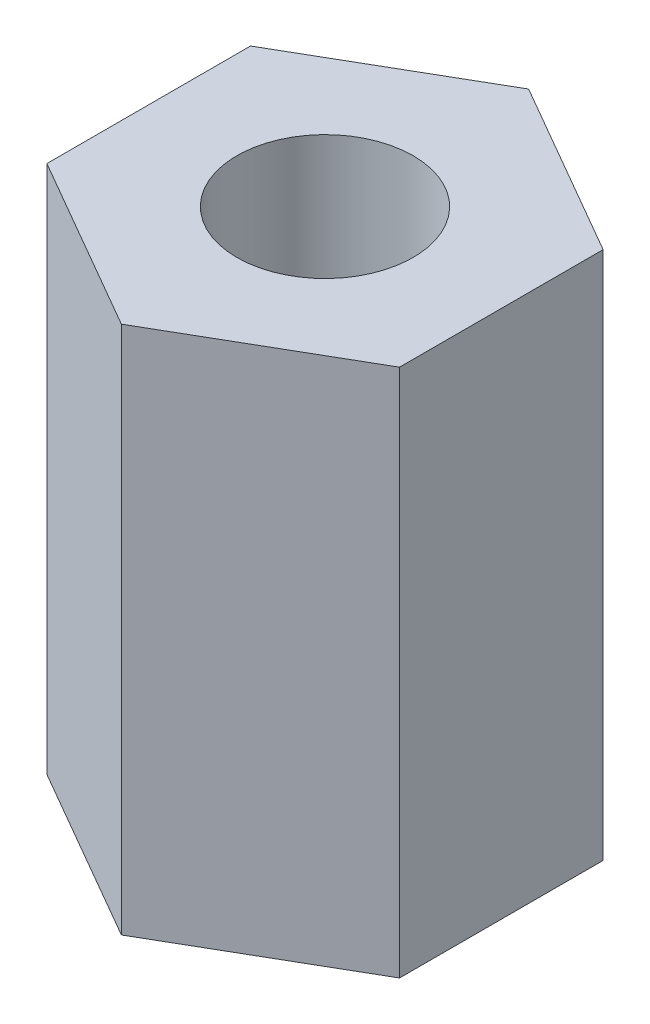
ISO-10303-21;
HEADER;
FILE_DESCRIPTION(('STEP AP214'),'2;1');
FILE_NAME('part.step','',(''),(''),'','','');
FILE_SCHEMA(('AUTOMOTIVE_DESIGN { 1 0 10303 214 1 1 1 1 }'));
ENDSEC;
DATA;
#1=APPLICATION_CONTEXT('core data for automotive mechanical design processes');
#2=APPLICATION_PROTOCOL_DEFINITION('international standard','automotive_design',2000,#1);
#3=PRODUCT_CONTEXT('',#1,'mechanical');
#4=PRODUCT('Part','Part','',(#3));
#5=PRODUCT_RELATED_PRODUCT_CATEGORY('part','',(#4));
#6=PRODUCT_DEFINITION_FORMATION('','',#4);
#7=PRODUCT_DEFINITION_CONTEXT('part definition',#1,'design');
#8=PRODUCT_DEFINITION('design','',#6,#7);
#9=PRODUCT_DEFINITION_SHAPE('','',#8);
#10=(LENGTH_UNIT() NAMED_UNIT(*) SI_UNIT(.MILLI.,.METRE.));
#11=(NAMED_UNIT(*) PLANE_ANGLE_UNIT() SI_UNIT($,.RADIAN.));
#12=(NAMED_UNIT(*) SI_UNIT($,.STERADIAN.) SOLID_ANGLE_UNIT());
#13=UNCERTAINTY_MEASURE_WITH_UNIT(LENGTH_MEASURE(1.E-05),#10,'distance_accuracy_value','');
#14=(GEOMETRIC_REPRESENTATION_CONTEXT(3) GLOBAL_UNCERTAINTY_ASSIGNED_CONTEXT((#13)) GLOBAL_UNIT_ASSIGNED_CONTEXT((#10,
#11,#12)) REPRESENTATION_CONTEXT('',''));
#15=CARTESIAN_POINT('',(0.,0.,0.));
#16=DIRECTION('',(0.,0.,1.));
#17=DIRECTION('',(1.,0.,0.));
#18=AXIS2_PLACEMENT_3D('',#15,#16,#17);
#19=CARTESIAN_POINT('',(0.,6.,0.));
#20=DIRECTION('',(0.,1.,0.));
#21=DIRECTION('',(0.,0.,1.));
#22=AXIS2_PLACEMENT_3D('',#19,#20,#21);
#23=PLANE('',#22);
#24=DIRECTION('',(0.866025403784439,0.,-0.5));
#25=VECTOR('',#24,1.);
#26=CARTESIAN_POINT('',(0.,6.,2.3094010767585));
#27=LINE('',#26,#25);
#28=CARTESIAN_POINT('',(0.,6.,2.3094010767585));
#29=VERTEX_POINT('',#28);
#30=CARTESIAN_POINT('',(2.,6.,1.15470053837925));
#31=VERTEX_POINT('',#30);
#32=EDGE_CURVE('E135',#29,#31,#27,.T.);
#33=ORIENTED_EDGE('',*,*,#32,.T.);
#34=DIRECTION('',(0.,0.,-1.));
#35=VECTOR('',#34,1.);
#36=CARTESIAN_POINT('',(2.,6.,1.15470053837925));
#37=LINE('',#36,#35);
#38=CARTESIAN_POINT('',(2.,6.,-1.15470053837925));
#39=VERTEX_POINT('',#38);
#40=EDGE_CURVE('E93',#31,#39,#37,.T.);
#41=ORIENTED_EDGE('',*,*,#40,.T.);
#42=DIRECTION('',(-0.866025403784439,0.,-0.5));
#43=VECTOR('',#42,1.);
#44=CARTESIAN_POINT('',(2.,6.,-1.15470053837925));
#45=LINE('',#44,#43);
#46=CARTESIAN_POINT('',(0.,6.,-2.3094010767585));
#47=VERTEX_POINT('',#46);
#48=EDGE_CURVE('E106',#39,#47,#45,.T.);
#49=ORIENTED_EDGE('',*,*,#48,.T.);
#50=DIRECTION('',(-0.866025403784439,0.,0.5));
#51=VECTOR('',#50,1.);
#52=CARTESIAN_POINT('',(0.,6.,-2.3094010767585));
#53=LINE('',#52,#51);
#54=CARTESIAN_POINT('',(-2.,6.,-1.15470053837925));
#55=VERTEX_POINT('',#54);
#56=EDGE_CURVE('E100',#47,#55,#53,.T.);
#57=ORIENTED_EDGE('',*,*,#56,.T.);
#58=DIRECTION('',(0.,0.,1.));
#59=VECTOR('',#58,1.);
#60=CARTESIAN_POINT('',(-2.,6.,-1.15470053837925));
#61=LINE('',#60,#59);
#62=CARTESIAN_POINT('',(-2.,6.,1.15470053837925));
#63=VERTEX_POINT('',#62);
#64=EDGE_CURVE('E104',#55,#63,#61,.T.);
#65=ORIENTED_EDGE('',*,*,#64,.T.);
#66=DIRECTION('',(0.866025403784438,0.,0.5));
#67=VECTOR('',#66,1.);
#68=CARTESIAN_POINT('',(-2.,6.,1.15470053837925));
#69=LINE('',#68,#67);
#70=EDGE_CURVE('E56',#63,#29,#69,.T.);
#71=ORIENTED_EDGE('',*,*,#70,.T.);
#72=EDGE_LOOP('',(#33,#41,#49,#57,#65,#71));
#73=FACE_BOUND('',#72,.T.);
#74=CARTESIAN_POINT('',(0.,6.,0.));
#75=DIRECTION('',(0.,1.,0.));
#76=DIRECTION('',(0.,0.,1.));
#77=AXIS2_PLACEMENT_3D('',#74,#75,#76);
#78=CIRCLE('',#77,1.);
#79=CARTESIAN_POINT('',(0.,6.,1.));
#80=VERTEX_POINT('',#79);
#81=EDGE_CURVE('E128',#80,#80,#78,.T.);
#82=ORIENTED_EDGE('',*,*,#81,.F.);
#83=EDGE_LOOP('',(#82));
#84=FACE_BOUND('',#83,.T.);
#85=ADVANCED_FACE('F39',(#73,#84),#23,.T.);
#86=CARTESIAN_POINT('',(0.,0.,0.));
#87=DIRECTION('',(0.,1.,0.));
#88=DIRECTION('',(0.,0.,1.));
#89=AXIS2_PLACEMENT_3D('',#86,#87,#88);
#90=PLANE('',#89);
#91=DIRECTION('',(0.866025403784439,0.,-0.5));
#92=VECTOR('',#91,1.);
#93=CARTESIAN_POINT('',(0.,0.,2.3094010767585));
#94=LINE('',#93,#92);
#95=CARTESIAN_POINT('',(0.,0.,2.3094010767585));
#96=VERTEX_POINT('',#95);
#97=CARTESIAN_POINT('',(2.,0.,1.15470053837925));
#98=VERTEX_POINT('',#97);
#99=EDGE_CURVE('E124',#96,#98,#94,.T.);
#100=ORIENTED_EDGE('',*,*,#99,.F.);
#101=DIRECTION('',(0.866025403784438,0.,0.5));
#102=VECTOR('',#101,1.);
#103=CARTESIAN_POINT('',(-2.,0.,1.15470053837925));
#104=LINE('',#103,#102);
#105=CARTESIAN_POINT('',(-2.,0.,1.15470053837925));
#106=VERTEX_POINT('',#105);
#107=EDGE_CURVE('E85',#106,#96,#104,.T.);
#108=ORIENTED_EDGE('',*,*,#107,.F.);
#109=DIRECTION('',(0.,0.,1.));
#110=VECTOR('',#109,1.);
#111=CARTESIAN_POINT('',(-2.,0.,-1.15470053837925));
#112=LINE('',#111,#110);
#113=CARTESIAN_POINT('',(-2.,0.,-1.15470053837925));
#114=VERTEX_POINT('',#113);
#115=EDGE_CURVE('E79',#114,#106,#112,.T.);
#116=ORIENTED_EDGE('',*,*,#115,.F.);
#117=DIRECTION('',(-0.866025403784439,0.,0.5));
#118=VECTOR('',#117,1.);
#119=CARTESIAN_POINT('',(0.,0.,-2.3094010767585));
#120=LINE('',#119,#118);
#121=CARTESIAN_POINT('',(0.,0.,-2.3094010767585));
#122=VERTEX_POINT('',#121);
#123=EDGE_CURVE('E114',#122,#114,#120,.T.);
#124=ORIENTED_EDGE('',*,*,#123,.F.);
#125=DIRECTION('',(-0.866025403784439,0.,-0.5));
#126=VECTOR('',#125,1.);
#127=CARTESIAN_POINT('',(2.,0.,-1.15470053837925));
#128=LINE('',#127,#126);
#129=CARTESIAN_POINT('',(2.,0.,-1.15470053837925));
#130=VERTEX_POINT('',#129);
#131=EDGE_CURVE('E130',#130,#122,#128,.T.);
#132=ORIENTED_EDGE('',*,*,#131,.F.);
#133=DIRECTION('',(0.,0.,-1.));
#134=VECTOR('',#133,1.);
#135=CARTESIAN_POINT('',(2.,0.,1.15470053837925));
#136=LINE('',#135,#134);
#137=EDGE_CURVE('E127',#98,#130,#136,.T.);
#138=ORIENTED_EDGE('',*,*,#137,.F.);
#139=EDGE_LOOP('',(#100,#108,#116,#124,#132,#138));
#140=FACE_BOUND('',#139,.T.);
#141=CARTESIAN_POINT('',(0.,0.,0.));
#142=DIRECTION('',(0.,1.,0.));
#143=DIRECTION('',(0.,0.,1.));
#144=AXIS2_PLACEMENT_3D('',#141,#142,#143);
#145=CIRCLE('',#144,1.);
#146=CARTESIAN_POINT('',(0.,0.,1.));
#147=VERTEX_POINT('',#146);
#148=EDGE_CURVE('E228',#147,#147,#145,.T.);
#149=ORIENTED_EDGE('',*,*,#148,.T.);
#150=EDGE_LOOP('',(#149));
#151=FACE_BOUND('',#150,.T.);
#152=ADVANCED_FACE('F144',(#140,#151),#90,.F.);
#153=CARTESIAN_POINT('',(0.,6.,2.3094010767585));
#154=DIRECTION('',(-0.5,0.,-0.866025403784439));
#155=DIRECTION('',(-0.866025403784439,0.,0.5));
#156=AXIS2_PLACEMENT_3D('',#153,#154,#155);
#157=PLANE('',#156);
#158=ORIENTED_EDGE('',*,*,#99,.T.);
#159=DIRECTION('',(0.,-1.,0.));
#160=VECTOR('',#159,1.);
#161=CARTESIAN_POINT('',(2.,6.,1.15470053837925));
#162=LINE('',#161,#160);
#163=EDGE_CURVE('E11',#31,#98,#162,.T.);
#164=ORIENTED_EDGE('',*,*,#163,.F.);
#165=ORIENTED_EDGE('',*,*,#32,.F.);
#166=DIRECTION('',(0.,-1.,0.));
#167=VECTOR('',#166,1.);
#168=CARTESIAN_POINT('',(0.,6.,2.3094010767585));
#169=LINE('',#168,#167);
#170=EDGE_CURVE('E120',#29,#96,#169,.T.);
#171=ORIENTED_EDGE('',*,*,#170,.T.);
#172=EDGE_LOOP('',(#158,#164,#165,#171));
#173=FACE_BOUND('',#172,.T.);
#174=ADVANCED_FACE('F41',(#173),#157,.F.);
#175=CARTESIAN_POINT('',(2.,6.,1.15470053837925));
#176=DIRECTION('',(-1.,0.,0.));
#177=DIRECTION('',(0.,0.,1.));
#178=AXIS2_PLACEMENT_3D('',#175,#176,#177);
#179=PLANE('',#178);
#180=ORIENTED_EDGE('',*,*,#137,.T.);
#181=DIRECTION('',(0.,-1.,0.));
#182=VECTOR('',#181,1.);
#183=CARTESIAN_POINT('',(2.,6.,-1.15470053837925));
#184=LINE('',#183,#182);
#185=EDGE_CURVE('E48',#39,#130,#184,.T.);
#186=ORIENTED_EDGE('',*,*,#185,.F.);
#187=ORIENTED_EDGE('',*,*,#40,.F.);
#188=ORIENTED_EDGE('',*,*,#163,.T.);
#189=EDGE_LOOP('',(#180,#186,#187,#188));
#190=FACE_BOUND('',#189,.T.);
#191=ADVANCED_FACE('F169',(#190),#179,.F.);
#192=CARTESIAN_POINT('',(2.,6.,-1.15470053837925));
#193=DIRECTION('',(-0.5,0.,0.866025403784439));
#194=DIRECTION('',(0.866025403784439,0.,0.5));
#195=AXIS2_PLACEMENT_3D('',#192,#193,#194);
#196=PLANE('',#195);
#197=ORIENTED_EDGE('',*,*,#131,.T.);
#198=DIRECTION('',(0.,-1.,0.));
#199=VECTOR('',#198,1.);
#200=CARTESIAN_POINT('',(0.,6.,-2.3094010767585));
#201=LINE('',#200,#199);
#202=EDGE_CURVE('E115',#47,#122,#201,.T.);
#203=ORIENTED_EDGE('',*,*,#202,.F.);
#204=ORIENTED_EDGE('',*,*,#48,.F.);
#205=ORIENTED_EDGE('',*,*,#185,.T.);
#206=EDGE_LOOP('',(#197,#203,#204,#205));
#207=FACE_BOUND('',#206,.T.);
#208=ADVANCED_FACE('F141',(#207),#196,.F.);
#209=CARTESIAN_POINT('',(0.,6.,-2.3094010767585));
#210=DIRECTION('',(0.5,0.,0.866025403784439));
#211=DIRECTION('',(0.866025403784439,0.,-0.5));
#212=AXIS2_PLACEMENT_3D('',#209,#210,#211);
#213=PLANE('',#212);
#214=ORIENTED_EDGE('',*,*,#123,.T.);
#215=DIRECTION('',(0.,-1.,0.));
#216=VECTOR('',#215,1.);
#217=CARTESIAN_POINT('',(-2.,6.,-1.15470053837925));
#218=LINE('',#217,#216);
#219=EDGE_CURVE('E111',#55,#114,#218,.T.);
#220=ORIENTED_EDGE('',*,*,#219,.F.);
#221=ORIENTED_EDGE('',*,*,#56,.F.);
#222=ORIENTED_EDGE('',*,*,#202,.T.);
#223=EDGE_LOOP('',(#214,#220,#221,#222));
#224=FACE_BOUND('',#223,.T.);
#225=ADVANCED_FACE('F112',(#224),#213,.F.);
#226=CARTESIAN_POINT('',(-2.,6.,-1.15470053837925));
#227=DIRECTION('',(1.,0.,0.));
#228=DIRECTION('',(0.,0.,-1.));
#229=AXIS2_PLACEMENT_3D('',#226,#227,#228);
#230=PLANE('',#229);
#231=ORIENTED_EDGE('',*,*,#115,.T.);
#232=DIRECTION('',(0.,-1.,0.));
#233=VECTOR('',#232,1.);
#234=CARTESIAN_POINT('',(-2.,6.,1.15470053837925));
#235=LINE('',#234,#233);
#236=EDGE_CURVE('E116',#63,#106,#235,.T.);
#237=ORIENTED_EDGE('',*,*,#236,.F.);
#238=ORIENTED_EDGE('',*,*,#64,.F.);
#239=ORIENTED_EDGE('',*,*,#219,.T.);
#240=EDGE_LOOP('',(#231,#237,#238,#239));
#241=FACE_BOUND('',#240,.T.);
#242=ADVANCED_FACE('F118',(#241),#230,.F.);
#243=CARTESIAN_POINT('',(-2.,6.,1.15470053837925));
#244=DIRECTION('',(0.5,0.,-0.866025403784439));
#245=DIRECTION('',(-0.866025403784439,0.,-0.5));
#246=AXIS2_PLACEMENT_3D('',#243,#244,#245);
#247=PLANE('',#246);
#248=ORIENTED_EDGE('',*,*,#107,.T.);
#249=ORIENTED_EDGE('',*,*,#170,.F.);
#250=ORIENTED_EDGE('',*,*,#70,.F.);
#251=ORIENTED_EDGE('',*,*,#236,.T.);
#252=EDGE_LOOP('',(#248,#249,#250,#251));
#253=FACE_BOUND('',#252,.T.);
#254=ADVANCED_FACE('F149',(#253),#247,.F.);
#255=CARTESIAN_POINT('',(0.,6.,0.));
#256=DIRECTION('',(0.,-1.,0.));
#257=DIRECTION('',(0.,0.,-1.));
#258=AXIS2_PLACEMENT_3D('',#255,#256,#257);
#259=CYLINDRICAL_SURFACE('',#258,1.);
#260=ORIENTED_EDGE('',*,*,#81,.T.);
#261=EDGE_LOOP('',(#260));
#262=FACE_BOUND('',#261,.T.);
#263=ORIENTED_EDGE('',*,*,#148,.F.);
#264=EDGE_LOOP('',(#263));
#265=FACE_BOUND('',#264,.T.);
#266=ADVANCED_FACE('F151',(#262,#265),#259,.F.);
#267=CLOSED_SHELL('',(#85,#152,#174,#191,#208,#225,#242,#254,#266));
#268=MANIFOLD_SOLID_BREP('B2',#267);
#269=ADVANCED_BREP_SHAPE_REPRESENTATION('',(#18,#268),#14);
#270=SHAPE_DEFINITION_REPRESENTATION(#9,#269);
ENDSEC;
END-ISO-10303-21;
